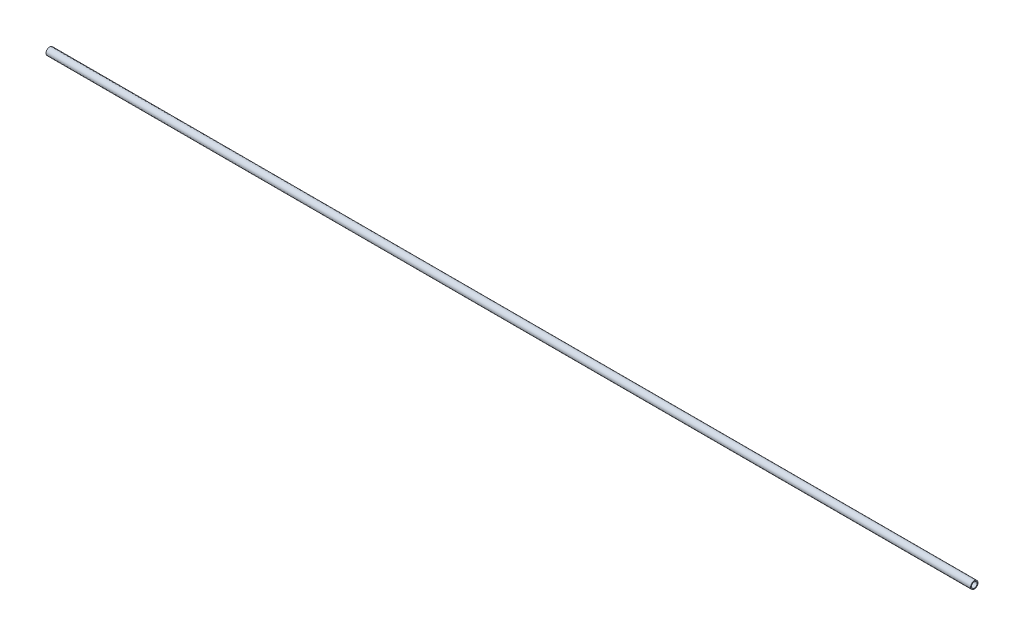
ISO-10303-21;
HEADER;
FILE_DESCRIPTION(('STEP AP214'),'2;1');
FILE_NAME('part.step','',(''),(''),'','','');
FILE_SCHEMA(('AUTOMOTIVE_DESIGN { 1 0 10303 214 1 1 1 1 }'));
ENDSEC;
DATA;
#1=APPLICATION_CONTEXT('core data for automotive mechanical design processes');
#2=APPLICATION_PROTOCOL_DEFINITION('international standard','automotive_design',2000,#1);
#3=PRODUCT_CONTEXT('',#1,'mechanical');
#4=PRODUCT('Part','Part','',(#3));
#5=PRODUCT_RELATED_PRODUCT_CATEGORY('part','',(#4));
#6=PRODUCT_DEFINITION_FORMATION('','',#4);
#7=PRODUCT_DEFINITION_CONTEXT('part definition',#1,'design');
#8=PRODUCT_DEFINITION('design','',#6,#7);
#9=PRODUCT_DEFINITION_SHAPE('','',#8);
#10=(LENGTH_UNIT() NAMED_UNIT(*) SI_UNIT(.MILLI.,.METRE.));
#11=(NAMED_UNIT(*) PLANE_ANGLE_UNIT() SI_UNIT($,.RADIAN.));
#12=(NAMED_UNIT(*) SI_UNIT($,.STERADIAN.) SOLID_ANGLE_UNIT());
#13=UNCERTAINTY_MEASURE_WITH_UNIT(LENGTH_MEASURE(1.E-05),#10,'distance_accuracy_value','');
#14=(GEOMETRIC_REPRESENTATION_CONTEXT(3) GLOBAL_UNCERTAINTY_ASSIGNED_CONTEXT((#13)) GLOBAL_UNIT_ASSIGNED_CONTEXT((#10,
#11,#12)) REPRESENTATION_CONTEXT('',''));
#15=CARTESIAN_POINT('',(0.,0.,0.));
#16=DIRECTION('',(0.,0.,1.));
#17=DIRECTION('',(1.,0.,0.));
#18=AXIS2_PLACEMENT_3D('',#15,#16,#17);
#19=CARTESIAN_POINT('',(501.,0.,0.));
#20=DIRECTION('',(1.,0.,0.));
#21=DIRECTION('',(0.,0.,-1.));
#22=AXIS2_PLACEMENT_3D('',#19,#20,#21);
#23=PLANE('',#22);
#24=CARTESIAN_POINT('',(501.,0.,0.));
#25=DIRECTION('',(1.,0.,0.));
#26=DIRECTION('',(0.,0.,-1.));
#27=AXIS2_PLACEMENT_3D('',#24,#25,#26);
#28=CIRCLE('',#27,2.);
#29=CARTESIAN_POINT('',(501.,0.,-2.));
#30=VERTEX_POINT('',#29);
#31=EDGE_CURVE('E10',#30,#30,#28,.T.);
#32=ORIENTED_EDGE('',*,*,#31,.T.);
#33=EDGE_LOOP('',(#32));
#34=FACE_BOUND('',#33,.T.);
#35=CARTESIAN_POINT('',(501.,0.,0.));
#36=DIRECTION('',(1.,0.,0.));
#37=DIRECTION('',(0.,0.,-1.));
#38=AXIS2_PLACEMENT_3D('',#35,#36,#37);
#39=CIRCLE('',#38,1.5);
#40=CARTESIAN_POINT('',(501.,0.,-1.5));
#41=VERTEX_POINT('',#40);
#42=EDGE_CURVE('E44',#41,#41,#39,.T.);
#43=ORIENTED_EDGE('',*,*,#42,.F.);
#44=EDGE_LOOP('',(#43));
#45=FACE_BOUND('',#44,.T.);
#46=ADVANCED_FACE('F33',(#34,#45),#23,.T.);
#47=CARTESIAN_POINT('',(0.,0.,0.));
#48=DIRECTION('',(1.,0.,0.));
#49=DIRECTION('',(0.,0.,-1.));
#50=AXIS2_PLACEMENT_3D('',#47,#48,#49);
#51=PLANE('',#50);
#52=CARTESIAN_POINT('',(0.,0.,0.));
#53=DIRECTION('',(1.,0.,0.));
#54=DIRECTION('',(0.,0.,-1.));
#55=AXIS2_PLACEMENT_3D('',#52,#53,#54);
#56=CIRCLE('',#55,2.);
#57=CARTESIAN_POINT('',(0.,0.,-2.));
#58=VERTEX_POINT('',#57);
#59=EDGE_CURVE('E37',#58,#58,#56,.T.);
#60=ORIENTED_EDGE('',*,*,#59,.F.);
#61=EDGE_LOOP('',(#60));
#62=FACE_BOUND('',#61,.T.);
#63=CARTESIAN_POINT('',(0.,0.,0.));
#64=DIRECTION('',(1.,0.,0.));
#65=DIRECTION('',(0.,0.,-1.));
#66=AXIS2_PLACEMENT_3D('',#63,#64,#65);
#67=CIRCLE('',#66,1.5);
#68=CARTESIAN_POINT('',(0.,0.,-1.5));
#69=VERTEX_POINT('',#68);
#70=EDGE_CURVE('E46',#69,#69,#67,.T.);
#71=ORIENTED_EDGE('',*,*,#70,.T.);
#72=EDGE_LOOP('',(#71));
#73=FACE_BOUND('',#72,.T.);
#74=ADVANCED_FACE('F56',(#62,#73),#51,.F.);
#75=CARTESIAN_POINT('',(501.,0.,0.));
#76=DIRECTION('',(-1.,0.,0.));
#77=DIRECTION('',(0.,0.,1.));
#78=AXIS2_PLACEMENT_3D('',#75,#76,#77);
#79=CYLINDRICAL_SURFACE('',#78,2.);
#80=ORIENTED_EDGE('',*,*,#31,.F.);
#81=EDGE_LOOP('',(#80));
#82=FACE_BOUND('',#81,.T.);
#83=ORIENTED_EDGE('',*,*,#59,.T.);
#84=EDGE_LOOP('',(#83));
#85=FACE_BOUND('',#84,.T.);
#86=ADVANCED_FACE('F35',(#82,#85),#79,.T.);
#87=CARTESIAN_POINT('',(501.,0.,0.));
#88=DIRECTION('',(-1.,0.,0.));
#89=DIRECTION('',(0.,0.,1.));
#90=AXIS2_PLACEMENT_3D('',#87,#88,#89);
#91=CYLINDRICAL_SURFACE('',#90,1.5);
#92=ORIENTED_EDGE('',*,*,#42,.T.);
#93=EDGE_LOOP('',(#92));
#94=FACE_BOUND('',#93,.T.);
#95=ORIENTED_EDGE('',*,*,#70,.F.);
#96=EDGE_LOOP('',(#95));
#97=FACE_BOUND('',#96,.T.);
#98=ADVANCED_FACE('F52',(#94,#97),#91,.F.);
#99=CLOSED_SHELL('',(#46,#74,#86,#98));
#100=MANIFOLD_SOLID_BREP('B2',#99);
#101=ADVANCED_BREP_SHAPE_REPRESENTATION('',(#18,#100),#14);
#102=SHAPE_DEFINITION_REPRESENTATION(#9,#101);
ENDSEC;
END-ISO-10303-21;
